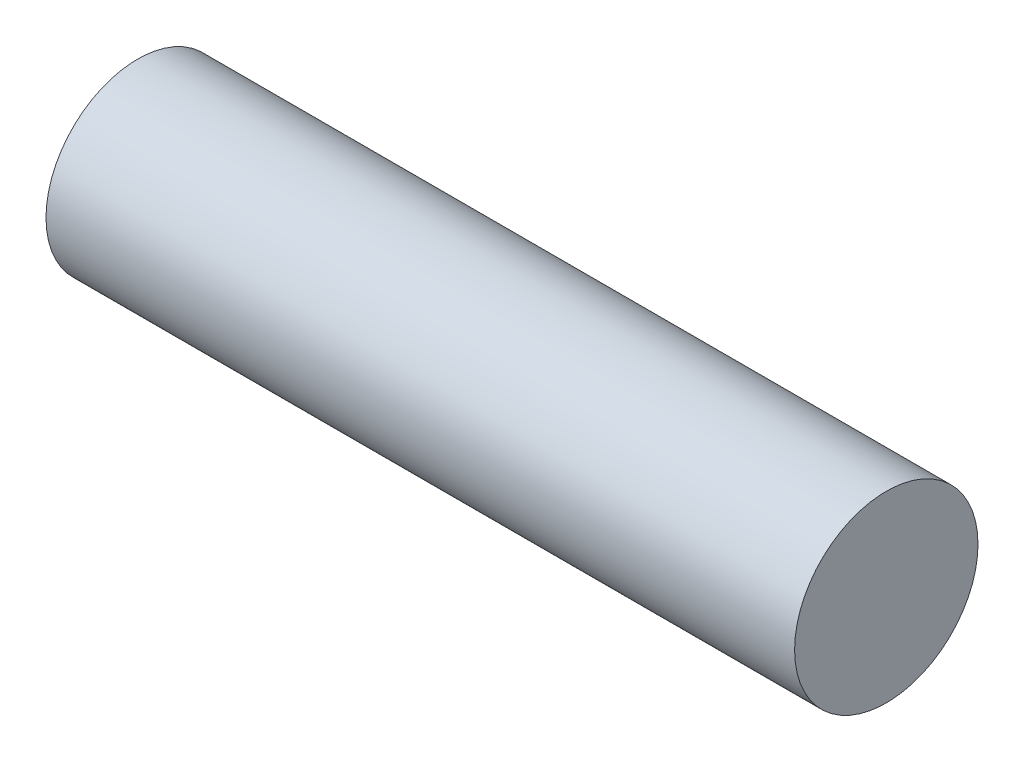
ISO-10303-21;
HEADER;
FILE_DESCRIPTION(('STEP AP214'),'2;1');
FILE_NAME('part.step','',(''),(''),'','','');
FILE_SCHEMA(('AUTOMOTIVE_DESIGN { 1 0 10303 214 1 1 1 1 }'));
ENDSEC;
DATA;
#1=APPLICATION_CONTEXT('core data for automotive mechanical design processes');
#2=APPLICATION_PROTOCOL_DEFINITION('international standard','automotive_design',2000,#1);
#3=PRODUCT_CONTEXT('',#1,'mechanical');
#4=PRODUCT('Part','Part','',(#3));
#5=PRODUCT_RELATED_PRODUCT_CATEGORY('part','',(#4));
#6=PRODUCT_DEFINITION_FORMATION('','',#4);
#7=PRODUCT_DEFINITION_CONTEXT('part definition',#1,'design');
#8=PRODUCT_DEFINITION('design','',#6,#7);
#9=PRODUCT_DEFINITION_SHAPE('','',#8);
#10=(LENGTH_UNIT() NAMED_UNIT(*) SI_UNIT(.MILLI.,.METRE.));
#11=(NAMED_UNIT(*) PLANE_ANGLE_UNIT() SI_UNIT($,.RADIAN.));
#12=(NAMED_UNIT(*) SI_UNIT($,.STERADIAN.) SOLID_ANGLE_UNIT());
#13=UNCERTAINTY_MEASURE_WITH_UNIT(LENGTH_MEASURE(1.E-05),#10,'distance_accuracy_value','');
#14=(GEOMETRIC_REPRESENTATION_CONTEXT(3) GLOBAL_UNCERTAINTY_ASSIGNED_CONTEXT((#13)) GLOBAL_UNIT_ASSIGNED_CONTEXT((#10,
#11,#12)) REPRESENTATION_CONTEXT('',''));
#15=CARTESIAN_POINT('',(0.,0.,0.));
#16=DIRECTION('',(0.,0.,1.));
#17=DIRECTION('',(1.,0.,0.));
#18=AXIS2_PLACEMENT_3D('',#15,#16,#17);
#19=CARTESIAN_POINT('',(10.,0.,0.));
#20=DIRECTION('',(-1.,0.,0.));
#21=DIRECTION('',(0.,0.,1.));
#22=AXIS2_PLACEMENT_3D('',#19,#20,#21);
#23=CYLINDRICAL_SURFACE('',#22,2.45);
#24=CARTESIAN_POINT('',(10.,0.,0.));
#25=DIRECTION('',(1.,0.,0.));
#26=DIRECTION('',(0.,0.,-1.));
#27=AXIS2_PLACEMENT_3D('',#24,#25,#26);
#28=CIRCLE('',#27,2.45);
#29=CARTESIAN_POINT('',(10.,0.,-2.45));
#30=VERTEX_POINT('',#29);
#31=EDGE_CURVE('E10',#30,#30,#28,.T.);
#32=ORIENTED_EDGE('',*,*,#31,.F.);
#33=EDGE_LOOP('',(#32));
#34=FACE_BOUND('',#33,.T.);
#35=CARTESIAN_POINT('',(-10.,0.,0.));
#36=DIRECTION('',(1.,0.,0.));
#37=DIRECTION('',(0.,0.,-1.));
#38=AXIS2_PLACEMENT_3D('',#35,#36,#37);
#39=CIRCLE('',#38,2.45);
#40=CARTESIAN_POINT('',(-10.,0.,-2.45));
#41=VERTEX_POINT('',#40);
#42=EDGE_CURVE('E40',#41,#41,#39,.T.);
#43=ORIENTED_EDGE('',*,*,#42,.T.);
#44=EDGE_LOOP('',(#43));
#45=FACE_BOUND('',#44,.T.);
#46=ADVANCED_FACE('F37',(#34,#45),#23,.T.);
#47=CARTESIAN_POINT('',(10.,0.,0.));
#48=DIRECTION('',(1.,0.,0.));
#49=DIRECTION('',(0.,0.,-1.));
#50=AXIS2_PLACEMENT_3D('',#47,#48,#49);
#51=PLANE('',#50);
#52=ORIENTED_EDGE('',*,*,#31,.T.);
#53=EDGE_LOOP('',(#52));
#54=FACE_BOUND('',#53,.T.);
#55=ADVANCED_FACE('F54',(#54),#51,.T.);
#56=CARTESIAN_POINT('',(-10.,0.,0.));
#57=DIRECTION('',(1.,0.,0.));
#58=DIRECTION('',(0.,0.,-1.));
#59=AXIS2_PLACEMENT_3D('',#56,#57,#58);
#60=PLANE('',#59);
#61=ORIENTED_EDGE('',*,*,#42,.F.);
#62=EDGE_LOOP('',(#61));
#63=FACE_BOUND('',#62,.T.);
#64=ADVANCED_FACE('F52',(#63),#60,.F.);
#65=CLOSED_SHELL('',(#46,#55,#64));
#66=MANIFOLD_SOLID_BREP('B2',#65);
#67=ADVANCED_BREP_SHAPE_REPRESENTATION('',(#18,#66),#14);
#68=SHAPE_DEFINITION_REPRESENTATION(#9,#67);
ENDSEC;
END-ISO-10303-21;
